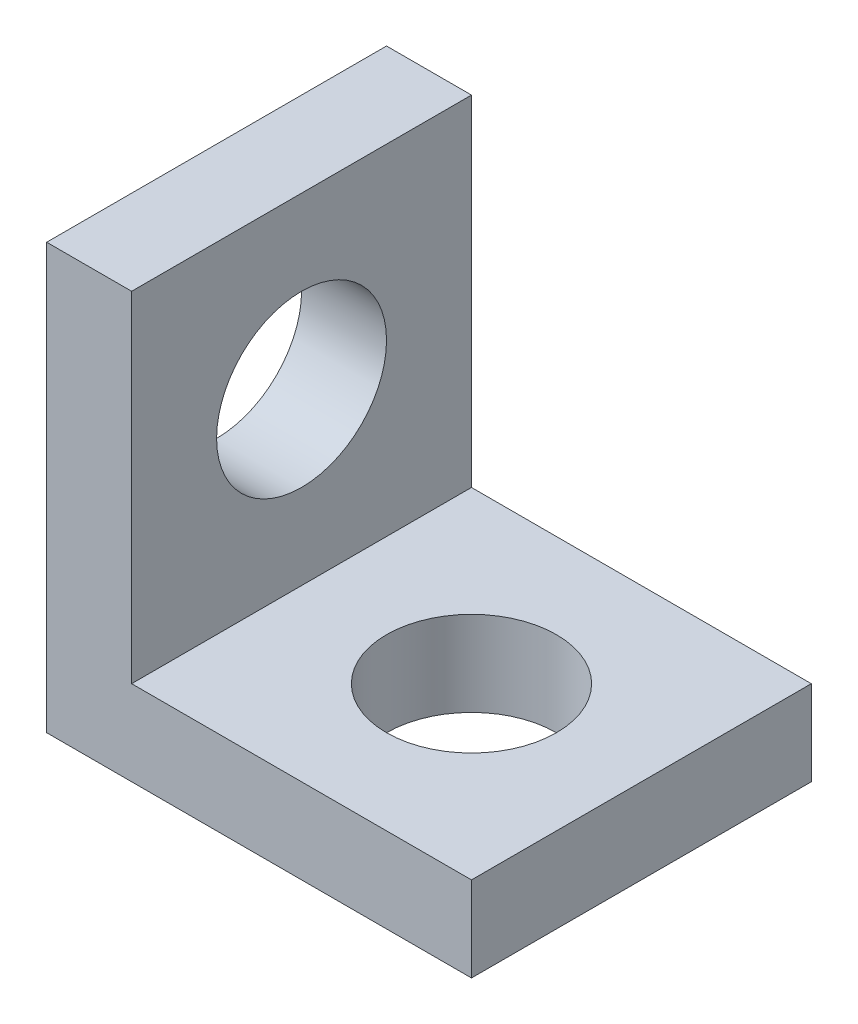
ISO-10303-21;
HEADER;
FILE_DESCRIPTION(('STEP AP214'),'2;1');
FILE_NAME('part.step','',(''),(''),'','','');
FILE_SCHEMA(('AUTOMOTIVE_DESIGN { 1 0 10303 214 1 1 1 1 }'));
ENDSEC;
DATA;
#1=APPLICATION_CONTEXT('core data for automotive mechanical design processes');
#2=APPLICATION_PROTOCOL_DEFINITION('international standard','automotive_design',2000,#1);
#3=PRODUCT_CONTEXT('',#1,'mechanical');
#4=PRODUCT('Part','Part','',(#3));
#5=PRODUCT_RELATED_PRODUCT_CATEGORY('part','',(#4));
#6=PRODUCT_DEFINITION_FORMATION('','',#4);
#7=PRODUCT_DEFINITION_CONTEXT('part definition',#1,'design');
#8=PRODUCT_DEFINITION('design','',#6,#7);
#9=PRODUCT_DEFINITION_SHAPE('','',#8);
#10=(LENGTH_UNIT() NAMED_UNIT(*) SI_UNIT(.MILLI.,.METRE.));
#11=(NAMED_UNIT(*) PLANE_ANGLE_UNIT() SI_UNIT($,.RADIAN.));
#12=(NAMED_UNIT(*) SI_UNIT($,.STERADIAN.) SOLID_ANGLE_UNIT());
#13=UNCERTAINTY_MEASURE_WITH_UNIT(LENGTH_MEASURE(1.E-05),#10,'distance_accuracy_value','');
#14=(GEOMETRIC_REPRESENTATION_CONTEXT(3) GLOBAL_UNCERTAINTY_ASSIGNED_CONTEXT((#13)) GLOBAL_UNIT_ASSIGNED_CONTEXT((#10,
#11,#12)) REPRESENTATION_CONTEXT('',''));
#15=CARTESIAN_POINT('',(0.,0.,0.));
#16=DIRECTION('',(0.,0.,1.));
#17=DIRECTION('',(1.,0.,0.));
#18=AXIS2_PLACEMENT_3D('',#15,#16,#17);
#19=CARTESIAN_POINT('',(-27.5871284254092,2.921,12.7));
#20=DIRECTION('',(0.,-1.,0.));
#21=DIRECTION('',(1.,0.,0.));
#22=AXIS2_PLACEMENT_3D('',#19,#20,#21);
#23=PLANE('',#22);
#24=DIRECTION('',(-1.,0.,0.));
#25=VECTOR('',#24,1.);
#26=CARTESIAN_POINT('',(-27.5871284254092,2.921,0.));
#27=LINE('',#26,#25);
#28=CARTESIAN_POINT('',(-27.5871284254092,2.921,0.));
#29=VERTEX_POINT('',#28);
#30=CARTESIAN_POINT('',(-30.7621284254092,2.92100000000001,0.));
#31=VERTEX_POINT('',#30);
#32=EDGE_CURVE('E117',#29,#31,#27,.T.);
#33=ORIENTED_EDGE('',*,*,#32,.T.);
#34=DIRECTION('',(0.,0.,-1.));
#35=VECTOR('',#34,1.);
#36=CARTESIAN_POINT('',(-30.7621284254092,2.92100000000001,12.7));
#37=LINE('',#36,#35);
#38=CARTESIAN_POINT('',(-30.7621284254092,2.92100000000001,12.7));
#39=VERTEX_POINT('',#38);
#40=EDGE_CURVE('E11',#39,#31,#37,.T.);
#41=ORIENTED_EDGE('',*,*,#40,.F.);
#42=DIRECTION('',(-1.,0.,0.));
#43=VECTOR('',#42,1.);
#44=CARTESIAN_POINT('',(-27.5871284254092,2.921,12.7));
#45=LINE('',#44,#43);
#46=CARTESIAN_POINT('',(-27.5871284254092,2.921,12.7));
#47=VERTEX_POINT('',#46);
#48=EDGE_CURVE('E128',#47,#39,#45,.T.);
#49=ORIENTED_EDGE('',*,*,#48,.F.);
#50=DIRECTION('',(0.,0.,-1.));
#51=VECTOR('',#50,1.);
#52=CARTESIAN_POINT('',(-27.5871284254092,2.921,12.7));
#53=LINE('',#52,#51);
#54=EDGE_CURVE('E113',#47,#29,#53,.T.);
#55=ORIENTED_EDGE('',*,*,#54,.T.);
#56=EDGE_LOOP('',(#33,#41,#49,#55));
#57=FACE_BOUND('',#56,.T.);
#58=ADVANCED_FACE('F33',(#57),#23,.F.);
#59=CARTESIAN_POINT('',(-30.7621284254092,2.92100000000001,12.7));
#60=DIRECTION('',(1.,0.,0.));
#61=DIRECTION('',(0.,1.,0.));
#62=AXIS2_PLACEMENT_3D('',#59,#60,#61);
#63=PLANE('',#62);
#64=CARTESIAN_POINT('',(-30.7621284254092,-3.429,6.35));
#65=DIRECTION('',(1.,0.,0.));
#66=DIRECTION('',(0.,1.,0.));
#67=AXIS2_PLACEMENT_3D('',#64,#65,#66);
#68=CIRCLE('',#67,3.175);
#69=CARTESIAN_POINT('',(-30.7621284254092,-0.254,6.35));
#70=VERTEX_POINT('',#69);
#71=EDGE_CURVE('E121',#70,#70,#68,.T.);
#72=ORIENTED_EDGE('',*,*,#71,.T.);
#73=EDGE_LOOP('',(#72));
#74=FACE_BOUND('',#73,.T.);
#75=DIRECTION('',(0.,-1.,0.));
#76=VECTOR('',#75,1.);
#77=CARTESIAN_POINT('',(-30.7621284254092,2.92100000000001,0.));
#78=LINE('',#77,#76);
#79=CARTESIAN_POINT('',(-30.7621284254092,-12.954,0.));
#80=VERTEX_POINT('',#79);
#81=EDGE_CURVE('E120',#31,#80,#78,.T.);
#82=ORIENTED_EDGE('',*,*,#81,.T.);
#83=DIRECTION('',(0.,0.,-1.));
#84=VECTOR('',#83,1.);
#85=CARTESIAN_POINT('',(-30.7621284254092,-12.954,12.7));
#86=LINE('',#85,#84);
#87=CARTESIAN_POINT('',(-30.7621284254092,-12.954,12.7));
#88=VERTEX_POINT('',#87);
#89=EDGE_CURVE('E41',#88,#80,#86,.T.);
#90=ORIENTED_EDGE('',*,*,#89,.F.);
#91=DIRECTION('',(0.,-1.,0.));
#92=VECTOR('',#91,1.);
#93=CARTESIAN_POINT('',(-30.7621284254092,2.92100000000001,12.7));
#94=LINE('',#93,#92);
#95=EDGE_CURVE('E86',#39,#88,#94,.T.);
#96=ORIENTED_EDGE('',*,*,#95,.F.);
#97=ORIENTED_EDGE('',*,*,#40,.T.);
#98=EDGE_LOOP('',(#82,#90,#96,#97));
#99=FACE_BOUND('',#98,.T.);
#100=ADVANCED_FACE('F155',(#74,#99),#63,.F.);
#101=CARTESIAN_POINT('',(-30.7621284254092,-12.954,12.7));
#102=DIRECTION('',(0.,1.,0.));
#103=DIRECTION('',(-1.,0.,0.));
#104=AXIS2_PLACEMENT_3D('',#101,#102,#103);
#105=PLANE('',#104);
#106=CARTESIAN_POINT('',(-21.2371284254092,-12.954,6.35));
#107=DIRECTION('',(0.,1.,0.));
#108=DIRECTION('',(-1.,0.,0.));
#109=AXIS2_PLACEMENT_3D('',#106,#107,#108);
#110=CIRCLE('',#109,3.175);
#111=CARTESIAN_POINT('',(-24.4121284254092,-12.954,6.35));
#112=VERTEX_POINT('',#111);
#113=EDGE_CURVE('E236',#112,#112,#110,.T.);
#114=ORIENTED_EDGE('',*,*,#113,.T.);
#115=EDGE_LOOP('',(#114));
#116=FACE_BOUND('',#115,.T.);
#117=DIRECTION('',(1.,0.,0.));
#118=VECTOR('',#117,1.);
#119=CARTESIAN_POINT('',(-30.7621284254092,-12.954,0.));
#120=LINE('',#119,#118);
#121=CARTESIAN_POINT('',(-14.8871284254092,-12.954,0.));
#122=VERTEX_POINT('',#121);
#123=EDGE_CURVE('E123',#80,#122,#120,.T.);
#124=ORIENTED_EDGE('',*,*,#123,.T.);
#125=DIRECTION('',(0.,0.,-1.));
#126=VECTOR('',#125,1.);
#127=CARTESIAN_POINT('',(-14.8871284254092,-12.954,12.7));
#128=LINE('',#127,#126);
#129=CARTESIAN_POINT('',(-14.8871284254092,-12.954,12.7));
#130=VERTEX_POINT('',#129);
#131=EDGE_CURVE('E108',#130,#122,#128,.T.);
#132=ORIENTED_EDGE('',*,*,#131,.F.);
#133=DIRECTION('',(1.,0.,0.));
#134=VECTOR('',#133,1.);
#135=CARTESIAN_POINT('',(-30.7621284254092,-12.954,12.7));
#136=LINE('',#135,#134);
#137=EDGE_CURVE('E99',#88,#130,#136,.T.);
#138=ORIENTED_EDGE('',*,*,#137,.F.);
#139=ORIENTED_EDGE('',*,*,#89,.T.);
#140=EDGE_LOOP('',(#124,#132,#138,#139));
#141=FACE_BOUND('',#140,.T.);
#142=ADVANCED_FACE('F134',(#116,#141),#105,.F.);
#143=CARTESIAN_POINT('',(-14.8871284254092,-12.954,12.7));
#144=DIRECTION('',(-1.,0.,0.));
#145=DIRECTION('',(0.,0.,1.));
#146=AXIS2_PLACEMENT_3D('',#143,#144,#145);
#147=PLANE('',#146);
#148=DIRECTION('',(0.,1.,0.));
#149=VECTOR('',#148,1.);
#150=CARTESIAN_POINT('',(-14.8871284254092,-12.954,0.));
#151=LINE('',#150,#149);
#152=CARTESIAN_POINT('',(-14.8871284254092,-9.779,0.));
#153=VERTEX_POINT('',#152);
#154=EDGE_CURVE('E107',#122,#153,#151,.T.);
#155=ORIENTED_EDGE('',*,*,#154,.T.);
#156=DIRECTION('',(0.,0.,-1.));
#157=VECTOR('',#156,1.);
#158=CARTESIAN_POINT('',(-14.8871284254092,-9.779,12.7));
#159=LINE('',#158,#157);
#160=CARTESIAN_POINT('',(-14.8871284254092,-9.779,12.7));
#161=VERTEX_POINT('',#160);
#162=EDGE_CURVE('E104',#161,#153,#159,.T.);
#163=ORIENTED_EDGE('',*,*,#162,.F.);
#164=DIRECTION('',(0.,1.,0.));
#165=VECTOR('',#164,1.);
#166=CARTESIAN_POINT('',(-14.8871284254092,-12.954,12.7));
#167=LINE('',#166,#165);
#168=EDGE_CURVE('E93',#130,#161,#167,.T.);
#169=ORIENTED_EDGE('',*,*,#168,.F.);
#170=ORIENTED_EDGE('',*,*,#131,.T.);
#171=EDGE_LOOP('',(#155,#163,#169,#170));
#172=FACE_BOUND('',#171,.T.);
#173=ADVANCED_FACE('F105',(#172),#147,.F.);
#174=CARTESIAN_POINT('',(-14.8871284254092,-9.779,12.7));
#175=DIRECTION('',(0.,-1.,0.));
#176=DIRECTION('',(1.,0.,0.));
#177=AXIS2_PLACEMENT_3D('',#174,#175,#176);
#178=PLANE('',#177);
#179=CARTESIAN_POINT('',(-21.2371284254092,-9.779,6.35));
#180=DIRECTION('',(0.,1.,0.));
#181=DIRECTION('',(-1.,0.,0.));
#182=AXIS2_PLACEMENT_3D('',#179,#180,#181);
#183=CIRCLE('',#182,3.175);
#184=CARTESIAN_POINT('',(-24.4121284254092,-9.779,6.35));
#185=VERTEX_POINT('',#184);
#186=EDGE_CURVE('E243',#185,#185,#183,.T.);
#187=ORIENTED_EDGE('',*,*,#186,.F.);
#188=EDGE_LOOP('',(#187));
#189=FACE_BOUND('',#188,.T.);
#190=DIRECTION('',(-1.,0.,0.));
#191=VECTOR('',#190,1.);
#192=CARTESIAN_POINT('',(-14.8871284254092,-9.779,0.));
#193=LINE('',#192,#191);
#194=CARTESIAN_POINT('',(-27.5871284254092,-9.779,0.));
#195=VERTEX_POINT('',#194);
#196=EDGE_CURVE('E72',#153,#195,#193,.T.);
#197=ORIENTED_EDGE('',*,*,#196,.T.);
#198=DIRECTION('',(0.,0.,-1.));
#199=VECTOR('',#198,1.);
#200=CARTESIAN_POINT('',(-27.5871284254092,-9.779,12.7));
#201=LINE('',#200,#199);
#202=CARTESIAN_POINT('',(-27.5871284254092,-9.779,12.7));
#203=VERTEX_POINT('',#202);
#204=EDGE_CURVE('E109',#203,#195,#201,.T.);
#205=ORIENTED_EDGE('',*,*,#204,.F.);
#206=DIRECTION('',(-1.,0.,0.));
#207=VECTOR('',#206,1.);
#208=CARTESIAN_POINT('',(-14.8871284254092,-9.779,12.7));
#209=LINE('',#208,#207);
#210=EDGE_CURVE('E97',#161,#203,#209,.T.);
#211=ORIENTED_EDGE('',*,*,#210,.F.);
#212=ORIENTED_EDGE('',*,*,#162,.T.);
#213=EDGE_LOOP('',(#197,#205,#211,#212));
#214=FACE_BOUND('',#213,.T.);
#215=ADVANCED_FACE('F111',(#189,#214),#178,.F.);
#216=CARTESIAN_POINT('',(-27.5871284254092,-9.779,12.7));
#217=DIRECTION('',(-1.,0.,0.));
#218=DIRECTION('',(0.,0.,1.));
#219=AXIS2_PLACEMENT_3D('',#216,#217,#218);
#220=PLANE('',#219);
#221=CARTESIAN_POINT('',(-27.5871284254092,-3.429,6.35));
#222=DIRECTION('',(1.,0.,0.));
#223=DIRECTION('',(0.,0.,-1.));
#224=AXIS2_PLACEMENT_3D('',#221,#222,#223);
#225=CIRCLE('',#224,3.175);
#226=CARTESIAN_POINT('',(-27.5871284254092,-3.429,3.175));
#227=VERTEX_POINT('',#226);
#228=EDGE_CURVE('E233',#227,#227,#225,.T.);
#229=ORIENTED_EDGE('',*,*,#228,.F.);
#230=EDGE_LOOP('',(#229));
#231=FACE_BOUND('',#230,.T.);
#232=DIRECTION('',(0.,1.,0.));
#233=VECTOR('',#232,1.);
#234=CARTESIAN_POINT('',(-27.5871284254092,-9.779,0.));
#235=LINE('',#234,#233);
#236=EDGE_CURVE('E78',#195,#29,#235,.T.);
#237=ORIENTED_EDGE('',*,*,#236,.T.);
#238=ORIENTED_EDGE('',*,*,#54,.F.);
#239=DIRECTION('',(0.,1.,0.));
#240=VECTOR('',#239,1.);
#241=CARTESIAN_POINT('',(-27.5871284254092,-9.779,12.7));
#242=LINE('',#241,#240);
#243=EDGE_CURVE('E49',#203,#47,#242,.T.);
#244=ORIENTED_EDGE('',*,*,#243,.F.);
#245=ORIENTED_EDGE('',*,*,#204,.T.);
#246=EDGE_LOOP('',(#237,#238,#244,#245));
#247=FACE_BOUND('',#246,.T.);
#248=ADVANCED_FACE('F141',(#231,#247),#220,.F.);
#249=CARTESIAN_POINT('',(0.,0.,12.7));
#250=DIRECTION('',(0.,0.,1.));
#251=DIRECTION('',(1.,0.,0.));
#252=AXIS2_PLACEMENT_3D('',#249,#250,#251);
#253=PLANE('',#252);
#254=ORIENTED_EDGE('',*,*,#48,.T.);
#255=ORIENTED_EDGE('',*,*,#95,.T.);
#256=ORIENTED_EDGE('',*,*,#137,.T.);
#257=ORIENTED_EDGE('',*,*,#168,.T.);
#258=ORIENTED_EDGE('',*,*,#210,.T.);
#259=ORIENTED_EDGE('',*,*,#243,.T.);
#260=EDGE_LOOP('',(#254,#255,#256,#257,#258,#259));
#261=FACE_BOUND('',#260,.T.);
#262=ADVANCED_FACE('F95',(#261),#253,.T.);
#263=CARTESIAN_POINT('',(0.,0.,0.));
#264=DIRECTION('',(0.,0.,1.));
#265=DIRECTION('',(1.,0.,0.));
#266=AXIS2_PLACEMENT_3D('',#263,#264,#265);
#267=PLANE('',#266);
#268=ORIENTED_EDGE('',*,*,#32,.F.);
#269=ORIENTED_EDGE('',*,*,#236,.F.);
#270=ORIENTED_EDGE('',*,*,#196,.F.);
#271=ORIENTED_EDGE('',*,*,#154,.F.);
#272=ORIENTED_EDGE('',*,*,#123,.F.);
#273=ORIENTED_EDGE('',*,*,#81,.F.);
#274=EDGE_LOOP('',(#268,#269,#270,#271,#272,#273));
#275=FACE_BOUND('',#274,.T.);
#276=ADVANCED_FACE('F137',(#275),#267,.F.);
#277=CARTESIAN_POINT('',(-40.2871284254092,-3.429,6.35));
#278=DIRECTION('',(1.,0.,0.));
#279=DIRECTION('',(0.,0.,-1.));
#280=AXIS2_PLACEMENT_3D('',#277,#278,#279);
#281=CYLINDRICAL_SURFACE('',#280,3.175);
#282=ORIENTED_EDGE('',*,*,#228,.T.);
#283=EDGE_LOOP('',(#282));
#284=FACE_BOUND('',#283,.T.);
#285=ORIENTED_EDGE('',*,*,#71,.F.);
#286=EDGE_LOOP('',(#285));
#287=FACE_BOUND('',#286,.T.);
#288=ADVANCED_FACE('F190',(#284,#287),#281,.F.);
#289=CARTESIAN_POINT('',(-21.2371284254092,-22.479,6.35));
#290=DIRECTION('',(0.,1.,0.));
#291=DIRECTION('',(-1.,0.,0.));
#292=AXIS2_PLACEMENT_3D('',#289,#290,#291);
#293=CYLINDRICAL_SURFACE('',#292,3.175);
#294=ORIENTED_EDGE('',*,*,#186,.T.);
#295=EDGE_LOOP('',(#294));
#296=FACE_BOUND('',#295,.T.);
#297=ORIENTED_EDGE('',*,*,#113,.F.);
#298=EDGE_LOOP('',(#297));
#299=FACE_BOUND('',#298,.T.);
#300=ADVANCED_FACE('F186',(#296,#299),#293,.F.);
#301=CLOSED_SHELL('',(#58,#100,#142,#173,#215,#248,#262,#276,#288,#300));
#302=MANIFOLD_SOLID_BREP('B2',#301);
#303=ADVANCED_BREP_SHAPE_REPRESENTATION('',(#18,#302),#14);
#304=SHAPE_DEFINITION_REPRESENTATION(#9,#303);
ENDSEC;
END-ISO-10303-21;
